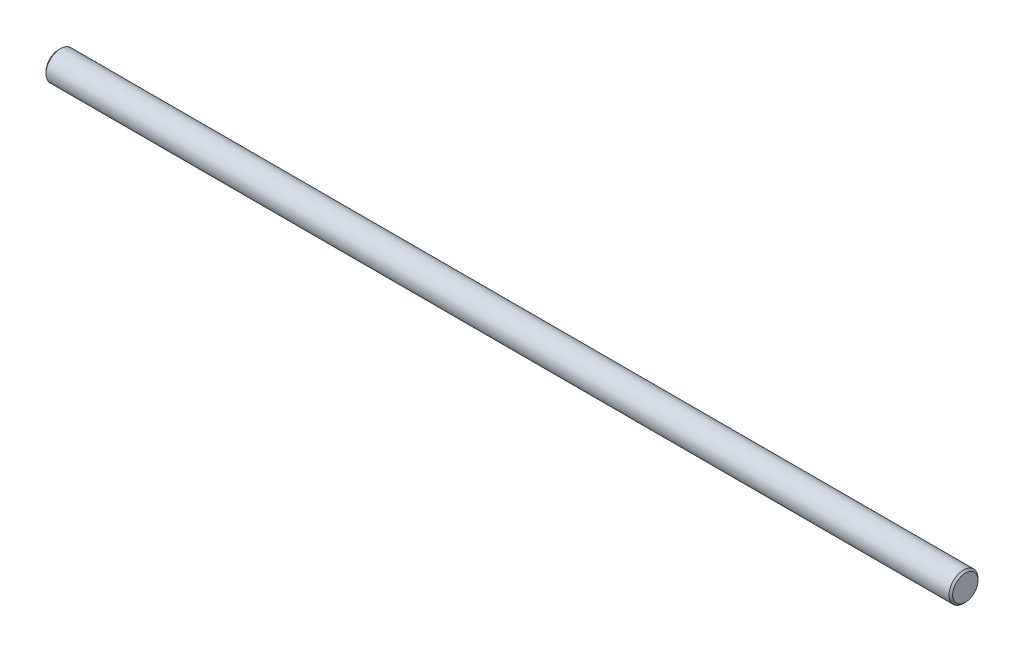
ISO-10303-21;
HEADER;
FILE_DESCRIPTION(('STEP AP214'),'2;1');
FILE_NAME('part.step','',(''),(''),'','','');
FILE_SCHEMA(('AUTOMOTIVE_DESIGN { 1 0 10303 214 1 1 1 1 }'));
ENDSEC;
DATA;
#1=APPLICATION_CONTEXT('core data for automotive mechanical design processes');
#2=APPLICATION_PROTOCOL_DEFINITION('international standard','automotive_design',2000,#1);
#3=PRODUCT_CONTEXT('',#1,'mechanical');
#4=PRODUCT('Part','Part','',(#3));
#5=PRODUCT_RELATED_PRODUCT_CATEGORY('part','',(#4));
#6=PRODUCT_DEFINITION_FORMATION('','',#4);
#7=PRODUCT_DEFINITION_CONTEXT('part definition',#1,'design');
#8=PRODUCT_DEFINITION('design','',#6,#7);
#9=PRODUCT_DEFINITION_SHAPE('','',#8);
#10=(LENGTH_UNIT() NAMED_UNIT(*) SI_UNIT(.MILLI.,.METRE.));
#11=(NAMED_UNIT(*) PLANE_ANGLE_UNIT() SI_UNIT($,.RADIAN.));
#12=(NAMED_UNIT(*) SI_UNIT($,.STERADIAN.) SOLID_ANGLE_UNIT());
#13=UNCERTAINTY_MEASURE_WITH_UNIT(LENGTH_MEASURE(1.E-05),#10,'distance_accuracy_value','');
#14=(GEOMETRIC_REPRESENTATION_CONTEXT(3) GLOBAL_UNCERTAINTY_ASSIGNED_CONTEXT((#13)) GLOBAL_UNIT_ASSIGNED_CONTEXT((#10,
#11,#12)) REPRESENTATION_CONTEXT('',''));
#15=CARTESIAN_POINT('',(0.,0.,0.));
#16=DIRECTION('',(0.,0.,1.));
#17=DIRECTION('',(1.,0.,0.));
#18=AXIS2_PLACEMENT_3D('',#15,#16,#17);
#19=CARTESIAN_POINT('',(0.,4.,0.));
#20=DIRECTION('',(1.,0.,0.));
#21=DIRECTION('',(0.,0.,-1.));
#22=AXIS2_PLACEMENT_3D('',#19,#20,#21);
#23=PLANE('',#22);
#24=CARTESIAN_POINT('',(0.,0.,0.));
#25=DIRECTION('',(1.,0.,0.));
#26=DIRECTION('',(0.,0.,-1.));
#27=AXIS2_PLACEMENT_3D('',#24,#25,#26);
#28=CIRCLE('',#27,3.49999999999998);
#29=CARTESIAN_POINT('',(0.,0.,-3.49999999999998));
#30=VERTEX_POINT('',#29);
#31=EDGE_CURVE('E48',#30,#30,#28,.F.);
#32=ORIENTED_EDGE('',*,*,#31,.T.);
#33=EDGE_LOOP('',(#32));
#34=FACE_BOUND('',#33,.T.);
#35=ADVANCED_FACE('F33',(#34),#23,.F.);
#36=CARTESIAN_POINT('',(250.,0.,0.));
#37=DIRECTION('',(-1.,0.,0.));
#38=DIRECTION('',(0.,0.,1.));
#39=AXIS2_PLACEMENT_3D('',#36,#37,#38);
#40=PLANE('',#39);
#41=CARTESIAN_POINT('',(250.,0.,0.));
#42=DIRECTION('',(-1.,0.,0.));
#43=DIRECTION('',(0.,0.,1.));
#44=AXIS2_PLACEMENT_3D('',#41,#42,#43);
#45=CIRCLE('',#44,3.5);
#46=CARTESIAN_POINT('',(250.,0.,3.5));
#47=VERTEX_POINT('',#46);
#48=EDGE_CURVE('E10',#47,#47,#45,.F.);
#49=ORIENTED_EDGE('',*,*,#48,.T.);
#50=EDGE_LOOP('',(#49));
#51=FACE_BOUND('',#50,.T.);
#52=ADVANCED_FACE('F64',(#51),#40,.F.);
#53=CARTESIAN_POINT('',(0.,0.,0.));
#54=DIRECTION('',(-1.,0.,0.));
#55=DIRECTION('',(0.,0.,1.));
#56=AXIS2_PLACEMENT_3D('',#53,#54,#55);
#57=CYLINDRICAL_SURFACE('',#56,4.);
#58=CARTESIAN_POINT('',(0.500000000000006,0.,0.));
#59=DIRECTION('',(1.,0.,0.));
#60=DIRECTION('',(0.,0.,-1.));
#61=AXIS2_PLACEMENT_3D('',#58,#59,#60);
#62=CIRCLE('',#61,4.);
#63=CARTESIAN_POINT('',(0.500000000000006,0.,-4.));
#64=VERTEX_POINT('',#63);
#65=EDGE_CURVE('E40',#64,#64,#62,.T.);
#66=ORIENTED_EDGE('',*,*,#65,.T.);
#67=EDGE_LOOP('',(#66));
#68=FACE_BOUND('',#67,.T.);
#69=CARTESIAN_POINT('',(249.5,0.,0.));
#70=DIRECTION('',(-1.,0.,0.));
#71=DIRECTION('',(0.,0.,1.));
#72=AXIS2_PLACEMENT_3D('',#69,#70,#71);
#73=CIRCLE('',#72,4.);
#74=CARTESIAN_POINT('',(249.5,0.,4.));
#75=VERTEX_POINT('',#74);
#76=EDGE_CURVE('E44',#75,#75,#73,.T.);
#77=ORIENTED_EDGE('',*,*,#76,.T.);
#78=EDGE_LOOP('',(#77));
#79=FACE_BOUND('',#78,.T.);
#80=ADVANCED_FACE('F57',(#68,#79),#57,.T.);
#81=CARTESIAN_POINT('',(0.,0.,0.));
#82=DIRECTION('',(1.,0.,0.));
#83=DIRECTION('',(0.,0.,-1.));
#84=AXIS2_PLACEMENT_3D('',#81,#82,#83);
#85=CONICAL_SURFACE('',#84,3.49999999999998,0.785398163397462);
#86=ORIENTED_EDGE('',*,*,#65,.F.);
#87=EDGE_LOOP('',(#86));
#88=FACE_BOUND('',#87,.T.);
#89=ORIENTED_EDGE('',*,*,#31,.F.);
#90=EDGE_LOOP('',(#89));
#91=FACE_BOUND('',#90,.T.);
#92=ADVANCED_FACE('F55',(#88,#91),#85,.T.);
#93=CARTESIAN_POINT('',(249.5,0.,0.));
#94=DIRECTION('',(-1.,0.,0.));
#95=DIRECTION('',(0.,0.,1.));
#96=AXIS2_PLACEMENT_3D('',#93,#94,#95);
#97=CONICAL_SURFACE('',#96,4.,0.785398163397496);
#98=ORIENTED_EDGE('',*,*,#48,.F.);
#99=EDGE_LOOP('',(#98));
#100=FACE_BOUND('',#99,.T.);
#101=ORIENTED_EDGE('',*,*,#76,.F.);
#102=EDGE_LOOP('',(#101));
#103=FACE_BOUND('',#102,.T.);
#104=ADVANCED_FACE('F35',(#100,#103),#97,.T.);
#105=CLOSED_SHELL('',(#35,#52,#80,#92,#104));
#106=MANIFOLD_SOLID_BREP('B2',#105);
#107=ADVANCED_BREP_SHAPE_REPRESENTATION('',(#18,#106),#14);
#108=SHAPE_DEFINITION_REPRESENTATION(#9,#107);
ENDSEC;
END-ISO-10303-21;
